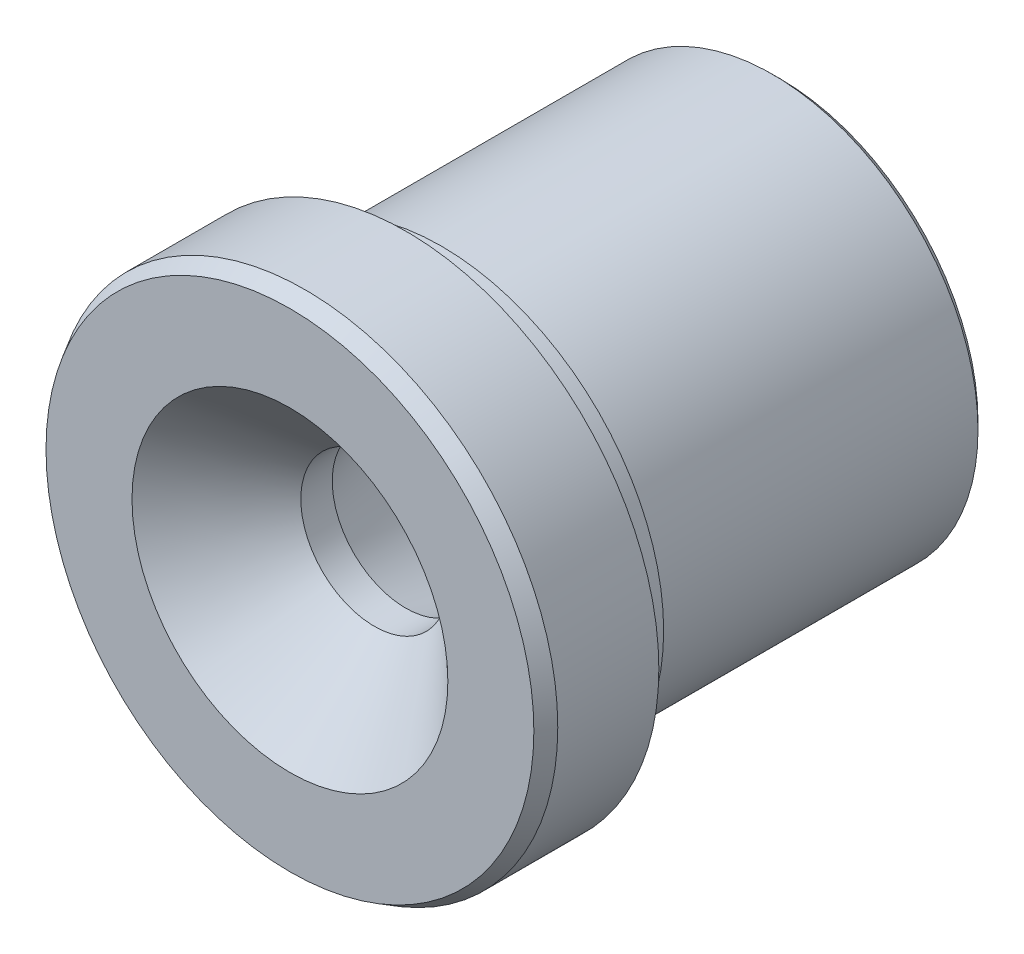
ISO-10303-21;
HEADER;
FILE_DESCRIPTION(('STEP AP214'),'2;1');
FILE_NAME('part.step','',(''),(''),'','','');
FILE_SCHEMA(('AUTOMOTIVE_DESIGN { 1 0 10303 214 1 1 1 1 }'));
ENDSEC;
DATA;
#1=APPLICATION_CONTEXT('core data for automotive mechanical design processes');
#2=APPLICATION_PROTOCOL_DEFINITION('international standard','automotive_design',2000,#1);
#3=PRODUCT_CONTEXT('',#1,'mechanical');
#4=PRODUCT('Part','Part','',(#3));
#5=PRODUCT_RELATED_PRODUCT_CATEGORY('part','',(#4));
#6=PRODUCT_DEFINITION_FORMATION('','',#4);
#7=PRODUCT_DEFINITION_CONTEXT('part definition',#1,'design');
#8=PRODUCT_DEFINITION('design','',#6,#7);
#9=PRODUCT_DEFINITION_SHAPE('','',#8);
#10=(LENGTH_UNIT() NAMED_UNIT(*) SI_UNIT(.MILLI.,.METRE.));
#11=(NAMED_UNIT(*) PLANE_ANGLE_UNIT() SI_UNIT($,.RADIAN.));
#12=(NAMED_UNIT(*) SI_UNIT($,.STERADIAN.) SOLID_ANGLE_UNIT());
#13=UNCERTAINTY_MEASURE_WITH_UNIT(LENGTH_MEASURE(1.E-05),#10,'distance_accuracy_value','');
#14=(GEOMETRIC_REPRESENTATION_CONTEXT(3) GLOBAL_UNCERTAINTY_ASSIGNED_CONTEXT((#13)) GLOBAL_UNIT_ASSIGNED_CONTEXT((#10,
#11,#12)) REPRESENTATION_CONTEXT('',''));
#15=CARTESIAN_POINT('',(0.,0.,0.));
#16=DIRECTION('',(0.,0.,1.));
#17=DIRECTION('',(1.,0.,0.));
#18=AXIS2_PLACEMENT_3D('',#15,#16,#17);
#19=CARTESIAN_POINT('',(0.,0.,-6.71657355679702));
#20=DIRECTION('',(0.,0.,1.));
#21=DIRECTION('',(1.,0.,0.));
#22=AXIS2_PLACEMENT_3D('',#19,#20,#21);
#23=CYLINDRICAL_SURFACE('',#22,10.3251);
#24=CARTESIAN_POINT('',(0.,0.,-24.257));
#25=DIRECTION('',(0.,0.,-1.));
#26=DIRECTION('',(-1.,0.,0.));
#27=AXIS2_PLACEMENT_3D('',#24,#25,#26);
#28=CIRCLE('',#27,10.3251);
#29=CARTESIAN_POINT('',(-10.3251,0.,-24.257));
#30=VERTEX_POINT('',#29);
#31=EDGE_CURVE('E50',#30,#30,#28,.F.);
#32=ORIENTED_EDGE('',*,*,#31,.T.);
#33=EDGE_LOOP('',(#32));
#34=FACE_BOUND('',#33,.T.);
#35=CARTESIAN_POINT('',(0.,0.,-7.62));
#36=DIRECTION('',(0.,0.,1.));
#37=DIRECTION('',(1.,0.,0.));
#38=AXIS2_PLACEMENT_3D('',#35,#36,#37);
#39=CIRCLE('',#38,10.3251);
#40=CARTESIAN_POINT('',(10.3251,0.,-7.62));
#41=VERTEX_POINT('',#40);
#42=EDGE_CURVE('E84',#41,#41,#39,.T.);
#43=ORIENTED_EDGE('',*,*,#42,.F.);
#44=EDGE_LOOP('',(#43));
#45=FACE_BOUND('',#44,.T.);
#46=ADVANCED_FACE('F42',(#34,#45),#23,.T.);
#47=CARTESIAN_POINT('',(0.,-10.3251,-24.638));
#48=DIRECTION('',(0.,0.,-1.));
#49=DIRECTION('',(-1.,0.,0.));
#50=AXIS2_PLACEMENT_3D('',#47,#48,#49);
#51=PLANE('',#50);
#52=CARTESIAN_POINT('',(0.,0.,-24.638));
#53=DIRECTION('',(0.,0.,-1.));
#54=DIRECTION('',(-1.,0.,0.));
#55=AXIS2_PLACEMENT_3D('',#52,#53,#54);
#56=CIRCLE('',#55,9.94410000000001);
#57=CARTESIAN_POINT('',(-9.94410000000001,0.,-24.638));
#58=VERTEX_POINT('',#57);
#59=EDGE_CURVE('E10',#58,#58,#56,.T.);
#60=ORIENTED_EDGE('',*,*,#59,.T.);
#61=EDGE_LOOP('',(#60));
#62=FACE_BOUND('',#61,.T.);
#63=CARTESIAN_POINT('',(0.,0.,-24.638));
#64=DIRECTION('',(0.,0.,1.));
#65=DIRECTION('',(1.,0.,0.));
#66=AXIS2_PLACEMENT_3D('',#63,#64,#65);
#67=CIRCLE('',#66,8.7376);
#68=CARTESIAN_POINT('',(8.7376,0.,-24.638));
#69=VERTEX_POINT('',#68);
#70=EDGE_CURVE('E63',#69,#69,#67,.T.);
#71=ORIENTED_EDGE('',*,*,#70,.T.);
#72=EDGE_LOOP('',(#71));
#73=FACE_BOUND('',#72,.T.);
#74=ADVANCED_FACE('F92',(#62,#73),#51,.T.);
#75=CARTESIAN_POINT('',(0.,0.,-24.638));
#76=DIRECTION('',(0.,0.,-1.));
#77=DIRECTION('',(-1.,0.,0.));
#78=AXIS2_PLACEMENT_3D('',#75,#76,#77);
#79=CONICAL_SURFACE('',#78,8.7376,0.261799387799143);
#80=CARTESIAN_POINT('',(0.,0.,-5.82137303331798));
#81=DIRECTION('',(0.,0.,1.));
#82=DIRECTION('',(1.,0.,0.));
#83=AXIS2_PLACEMENT_3D('',#80,#81,#82);
#84=CIRCLE('',#83,3.6957);
#85=CARTESIAN_POINT('',(3.6957,0.,-5.82137303331798));
#86=VERTEX_POINT('',#85);
#87=EDGE_CURVE('E66',#86,#86,#84,.T.);
#88=ORIENTED_EDGE('',*,*,#87,.T.);
#89=EDGE_LOOP('',(#88));
#90=FACE_BOUND('',#89,.T.);
#91=ORIENTED_EDGE('',*,*,#70,.F.);
#92=EDGE_LOOP('',(#91));
#93=FACE_BOUND('',#92,.T.);
#94=ADVANCED_FACE('F97',(#90,#93),#79,.F.);
#95=CARTESIAN_POINT('',(0.,0.,-6.71657355679702));
#96=DIRECTION('',(0.,0.,1.));
#97=DIRECTION('',(1.,0.,0.));
#98=AXIS2_PLACEMENT_3D('',#95,#96,#97);
#99=CYLINDRICAL_SURFACE('',#98,3.6957);
#100=CARTESIAN_POINT('',(0.,0.,-4.24180000000005));
#101=DIRECTION('',(0.,0.,1.));
#102=DIRECTION('',(1.,0.,0.));
#103=AXIS2_PLACEMENT_3D('',#100,#101,#102);
#104=CIRCLE('',#103,3.6957);
#105=CARTESIAN_POINT('',(3.6957,0.,-4.24180000000005));
#106=VERTEX_POINT('',#105);
#107=EDGE_CURVE('E69',#106,#106,#104,.T.);
#108=ORIENTED_EDGE('',*,*,#107,.T.);
#109=EDGE_LOOP('',(#108));
#110=FACE_BOUND('',#109,.T.);
#111=ORIENTED_EDGE('',*,*,#87,.F.);
#112=EDGE_LOOP('',(#111));
#113=FACE_BOUND('',#112,.T.);
#114=ADVANCED_FACE('F127',(#110,#113),#99,.F.);
#115=CARTESIAN_POINT('',(0.,0.,-4.24180000000005));
#116=DIRECTION('',(0.,0.,1.));
#117=DIRECTION('',(1.,0.,0.));
#118=AXIS2_PLACEMENT_3D('',#115,#116,#117);
#119=CONICAL_SURFACE('',#118,3.6957,0.785398163397443);
#120=CARTESIAN_POINT('',(0.,0.,0.));
#121=DIRECTION('',(0.,0.,1.));
#122=DIRECTION('',(1.,0.,0.));
#123=AXIS2_PLACEMENT_3D('',#120,#121,#122);
#124=CIRCLE('',#123,7.9375);
#125=CARTESIAN_POINT('',(7.9375,0.,0.));
#126=VERTEX_POINT('',#125);
#127=EDGE_CURVE('E72',#126,#126,#124,.T.);
#128=ORIENTED_EDGE('',*,*,#127,.T.);
#129=EDGE_LOOP('',(#128));
#130=FACE_BOUND('',#129,.T.);
#131=ORIENTED_EDGE('',*,*,#107,.F.);
#132=EDGE_LOOP('',(#131));
#133=FACE_BOUND('',#132,.T.);
#134=ADVANCED_FACE('F121',(#130,#133),#119,.F.);
#135=CARTESIAN_POINT('',(0.,-7.9375,0.));
#136=DIRECTION('',(0.,0.,1.));
#137=DIRECTION('',(1.,0.,0.));
#138=AXIS2_PLACEMENT_3D('',#135,#136,#137);
#139=PLANE('',#138);
#140=CARTESIAN_POINT('',(0.,0.,0.));
#141=DIRECTION('',(0.,0.,1.));
#142=DIRECTION('',(1.,0.,0.));
#143=AXIS2_PLACEMENT_3D('',#140,#141,#142);
#144=CIRCLE('',#143,12.2600590948775);
#145=CARTESIAN_POINT('',(12.2600590948775,0.,0.));
#146=VERTEX_POINT('',#145);
#147=EDGE_CURVE('E58',#146,#146,#144,.T.);
#148=ORIENTED_EDGE('',*,*,#147,.T.);
#149=EDGE_LOOP('',(#148));
#150=FACE_BOUND('',#149,.T.);
#151=ORIENTED_EDGE('',*,*,#127,.F.);
#152=EDGE_LOOP('',(#151));
#153=FACE_BOUND('',#152,.T.);
#154=ADVANCED_FACE('F117',(#150,#153),#139,.T.);
#155=CARTESIAN_POINT('',(0.,0.,-6.71657355679702));
#156=DIRECTION('',(0.,0.,1.));
#157=DIRECTION('',(1.,0.,0.));
#158=AXIS2_PLACEMENT_3D('',#155,#156,#157);
#159=CYLINDRICAL_SURFACE('',#158,12.7);
#160=CARTESIAN_POINT('',(0.,0.,-0.761999999999995));
#161=DIRECTION('',(0.,0.,1.));
#162=DIRECTION('',(1.,0.,0.));
#163=AXIS2_PLACEMENT_3D('',#160,#161,#162);
#164=CIRCLE('',#163,12.7);
#165=CARTESIAN_POINT('',(12.7,0.,-0.761999999999995));
#166=VERTEX_POINT('',#165);
#167=EDGE_CURVE('E54',#166,#166,#164,.F.);
#168=ORIENTED_EDGE('',*,*,#167,.T.);
#169=EDGE_LOOP('',(#168));
#170=FACE_BOUND('',#169,.T.);
#171=CARTESIAN_POINT('',(0.,0.,-5.842));
#172=DIRECTION('',(0.,0.,1.));
#173=DIRECTION('',(1.,0.,0.));
#174=AXIS2_PLACEMENT_3D('',#171,#172,#173);
#175=CIRCLE('',#174,12.7);
#176=CARTESIAN_POINT('',(12.7,0.,-5.842));
#177=VERTEX_POINT('',#176);
#178=EDGE_CURVE('E75',#177,#177,#175,.T.);
#179=ORIENTED_EDGE('',*,*,#178,.T.);
#180=EDGE_LOOP('',(#179));
#181=FACE_BOUND('',#180,.T.);
#182=ADVANCED_FACE('F120',(#170,#181),#159,.T.);
#183=CARTESIAN_POINT('',(0.,-12.7,-5.842));
#184=DIRECTION('',(0.,0.,-1.));
#185=DIRECTION('',(-1.,0.,0.));
#186=AXIS2_PLACEMENT_3D('',#183,#184,#185);
#187=PLANE('',#186);
#188=CARTESIAN_POINT('',(0.,0.,-5.842));
#189=DIRECTION('',(0.,0.,1.));
#190=DIRECTION('',(1.,0.,0.));
#191=AXIS2_PLACEMENT_3D('',#188,#189,#190);
#192=CIRCLE('',#191,11.1633);
#193=CARTESIAN_POINT('',(11.1633,0.,-5.842));
#194=VERTEX_POINT('',#193);
#195=EDGE_CURVE('E78',#194,#194,#192,.T.);
#196=ORIENTED_EDGE('',*,*,#195,.T.);
#197=EDGE_LOOP('',(#196));
#198=FACE_BOUND('',#197,.T.);
#199=ORIENTED_EDGE('',*,*,#178,.F.);
#200=EDGE_LOOP('',(#199));
#201=FACE_BOUND('',#200,.T.);
#202=ADVANCED_FACE('F145',(#198,#201),#187,.T.);
#203=CARTESIAN_POINT('',(0.,0.,-6.71657355679702));
#204=DIRECTION('',(0.,0.,1.));
#205=DIRECTION('',(1.,0.,0.));
#206=AXIS2_PLACEMENT_3D('',#203,#204,#205);
#207=CYLINDRICAL_SURFACE('',#206,11.1633);
#208=CARTESIAN_POINT('',(0.,0.,-7.62));
#209=DIRECTION('',(0.,0.,1.));
#210=DIRECTION('',(1.,0.,0.));
#211=AXIS2_PLACEMENT_3D('',#208,#209,#210);
#212=CIRCLE('',#211,11.1633);
#213=CARTESIAN_POINT('',(11.1633,0.,-7.62));
#214=VERTEX_POINT('',#213);
#215=EDGE_CURVE('E81',#214,#214,#212,.T.);
#216=ORIENTED_EDGE('',*,*,#215,.T.);
#217=EDGE_LOOP('',(#216));
#218=FACE_BOUND('',#217,.T.);
#219=ORIENTED_EDGE('',*,*,#195,.F.);
#220=EDGE_LOOP('',(#219));
#221=FACE_BOUND('',#220,.T.);
#222=ADVANCED_FACE('F111',(#218,#221),#207,.T.);
#223=CARTESIAN_POINT('',(0.,-11.1633,-7.62));
#224=DIRECTION('',(0.,0.,-1.));
#225=DIRECTION('',(-1.,0.,0.));
#226=AXIS2_PLACEMENT_3D('',#223,#224,#225);
#227=PLANE('',#226);
#228=ORIENTED_EDGE('',*,*,#42,.T.);
#229=EDGE_LOOP('',(#228));
#230=FACE_BOUND('',#229,.T.);
#231=ORIENTED_EDGE('',*,*,#215,.F.);
#232=EDGE_LOOP('',(#231));
#233=FACE_BOUND('',#232,.T.);
#234=ADVANCED_FACE('F88',(#230,#233),#227,.T.);
#235=CARTESIAN_POINT('',(0.,0.,0.));
#236=DIRECTION('',(0.,0.,-1.));
#237=DIRECTION('',(-1.,0.,0.));
#238=AXIS2_PLACEMENT_3D('',#235,#236,#237);
#239=CONICAL_SURFACE('',#238,12.2600590948775,0.523598775598294);
#240=ORIENTED_EDGE('',*,*,#167,.F.);
#241=EDGE_LOOP('',(#240));
#242=FACE_BOUND('',#241,.T.);
#243=ORIENTED_EDGE('',*,*,#147,.F.);
#244=EDGE_LOOP('',(#243));
#245=FACE_BOUND('',#244,.T.);
#246=ADVANCED_FACE('F101',(#242,#245),#239,.T.);
#247=CARTESIAN_POINT('',(0.,0.,-24.257));
#248=DIRECTION('',(0.,0.,1.));
#249=DIRECTION('',(1.,0.,0.));
#250=AXIS2_PLACEMENT_3D('',#247,#248,#249);
#251=CONICAL_SURFACE('',#250,10.3251,0.785398163397442);
#252=ORIENTED_EDGE('',*,*,#59,.F.);
#253=EDGE_LOOP('',(#252));
#254=FACE_BOUND('',#253,.T.);
#255=ORIENTED_EDGE('',*,*,#31,.F.);
#256=EDGE_LOOP('',(#255));
#257=FACE_BOUND('',#256,.T.);
#258=ADVANCED_FACE('F45',(#254,#257),#251,.T.);
#259=CLOSED_SHELL('',(#46,#74,#94,#114,#134,#154,#182,#202,#222,#234,#246,#258));
#260=MANIFOLD_SOLID_BREP('B2',#259);
#261=ADVANCED_BREP_SHAPE_REPRESENTATION('',(#18,#260),#14);
#262=SHAPE_DEFINITION_REPRESENTATION(#9,#261);
ENDSEC;
END-ISO-10303-21;
